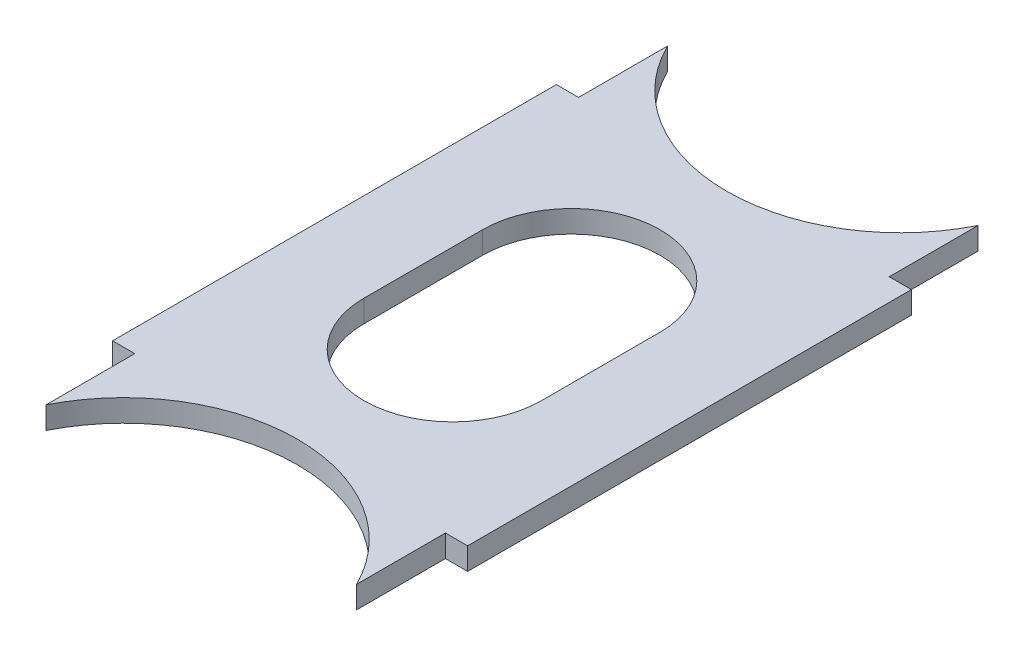
ISO-10303-21;
HEADER;
FILE_DESCRIPTION(('STEP AP214'),'2;1');
FILE_NAME('part.step','',(''),(''),'','','');
FILE_SCHEMA(('AUTOMOTIVE_DESIGN { 1 0 10303 214 1 1 1 1 }'));
ENDSEC;
DATA;
#1=APPLICATION_CONTEXT('core data for automotive mechanical design processes');
#2=APPLICATION_PROTOCOL_DEFINITION('international standard','automotive_design',2000,#1);
#3=PRODUCT_CONTEXT('',#1,'mechanical');
#4=PRODUCT('Part','Part','',(#3));
#5=PRODUCT_RELATED_PRODUCT_CATEGORY('part','',(#4));
#6=PRODUCT_DEFINITION_FORMATION('','',#4);
#7=PRODUCT_DEFINITION_CONTEXT('part definition',#1,'design');
#8=PRODUCT_DEFINITION('design','',#6,#7);
#9=PRODUCT_DEFINITION_SHAPE('','',#8);
#10=(LENGTH_UNIT() NAMED_UNIT(*) SI_UNIT(.MILLI.,.METRE.));
#11=(NAMED_UNIT(*) PLANE_ANGLE_UNIT() SI_UNIT($,.RADIAN.));
#12=(NAMED_UNIT(*) SI_UNIT($,.STERADIAN.) SOLID_ANGLE_UNIT());
#13=UNCERTAINTY_MEASURE_WITH_UNIT(LENGTH_MEASURE(1.E-05),#10,'distance_accuracy_value','');
#14=(GEOMETRIC_REPRESENTATION_CONTEXT(3) GLOBAL_UNCERTAINTY_ASSIGNED_CONTEXT((#13)) GLOBAL_UNIT_ASSIGNED_CONTEXT((#10,
#11,#12)) REPRESENTATION_CONTEXT('',''));
#15=CARTESIAN_POINT('',(0.,0.,0.));
#16=DIRECTION('',(0.,0.,1.));
#17=DIRECTION('',(1.,0.,0.));
#18=AXIS2_PLACEMENT_3D('',#15,#16,#17);
#19=CARTESIAN_POINT('',(0.,1.5875,-27.78125));
#20=DIRECTION('',(0.,-1.,0.));
#21=DIRECTION('',(0.,0.,-1.));
#22=AXIS2_PLACEMENT_3D('',#19,#20,#21);
#23=CYLINDRICAL_SURFACE('',#22,12.4241526999832);
#24=CARTESIAN_POINT('',(0.,0.,-27.78125));
#25=DIRECTION('',(0.,1.,0.));
#26=DIRECTION('',(0.,0.,1.));
#27=AXIS2_PLACEMENT_3D('',#24,#25,#26);
#28=CIRCLE('',#27,12.4241526999832);
#29=CARTESIAN_POINT('',(-11.1125,0.,-22.225));
#30=VERTEX_POINT('',#29);
#31=CARTESIAN_POINT('',(11.1125,0.,-22.225));
#32=VERTEX_POINT('',#31);
#33=EDGE_CURVE('E269',#30,#32,#28,.T.);
#34=ORIENTED_EDGE('',*,*,#33,.F.);
#35=DIRECTION('',(0.,-1.,0.));
#36=VECTOR('',#35,1.);
#37=CARTESIAN_POINT('',(-11.1125,1.5875,-22.225));
#38=LINE('',#37,#36);
#39=CARTESIAN_POINT('',(-11.1125,1.5875,-22.225));
#40=VERTEX_POINT('',#39);
#41=EDGE_CURVE('E11',#40,#30,#38,.T.);
#42=ORIENTED_EDGE('',*,*,#41,.F.);
#43=CARTESIAN_POINT('',(0.,1.5875,-27.78125));
#44=DIRECTION('',(0.,1.,0.));
#45=DIRECTION('',(0.,0.,1.));
#46=AXIS2_PLACEMENT_3D('',#43,#44,#45);
#47=CIRCLE('',#46,12.4241526999832);
#48=CARTESIAN_POINT('',(11.1125,1.5875,-22.225));
#49=VERTEX_POINT('',#48);
#50=EDGE_CURVE('E314',#40,#49,#47,.T.);
#51=ORIENTED_EDGE('',*,*,#50,.T.);
#52=DIRECTION('',(0.,-1.,0.));
#53=VECTOR('',#52,1.);
#54=CARTESIAN_POINT('',(11.1125,1.5875,-22.225));
#55=LINE('',#54,#53);
#56=EDGE_CURVE('E59',#49,#32,#55,.T.);
#57=ORIENTED_EDGE('',*,*,#56,.T.);
#58=EDGE_LOOP('',(#34,#42,#51,#57));
#59=FACE_BOUND('',#58,.T.);
#60=ADVANCED_FACE('F39',(#59),#23,.F.);
#61=CARTESIAN_POINT('',(-11.1125,1.5875,0.));
#62=DIRECTION('',(1.,0.,0.));
#63=DIRECTION('',(0.,0.,-1.));
#64=AXIS2_PLACEMENT_3D('',#61,#62,#63);
#65=PLANE('',#64);
#66=DIRECTION('',(0.,0.,1.));
#67=VECTOR('',#66,1.);
#68=CARTESIAN_POINT('',(-11.1125,0.,0.));
#69=LINE('',#68,#67);
#70=CARTESIAN_POINT('',(-11.1125,0.,-15.875));
#71=VERTEX_POINT('',#70);
#72=EDGE_CURVE('E265',#30,#71,#69,.T.);
#73=ORIENTED_EDGE('',*,*,#72,.T.);
#74=DIRECTION('',(0.,-1.,0.));
#75=VECTOR('',#74,1.);
#76=CARTESIAN_POINT('',(-11.1125,1.5875,-15.875));
#77=LINE('',#76,#75);
#78=CARTESIAN_POINT('',(-11.1125,1.5875,-15.875));
#79=VERTEX_POINT('',#78);
#80=EDGE_CURVE('E50',#79,#71,#77,.T.);
#81=ORIENTED_EDGE('',*,*,#80,.F.);
#82=DIRECTION('',(0.,0.,1.));
#83=VECTOR('',#82,1.);
#84=CARTESIAN_POINT('',(-11.1125,1.5875,0.));
#85=LINE('',#84,#83);
#86=EDGE_CURVE('E311',#40,#79,#85,.T.);
#87=ORIENTED_EDGE('',*,*,#86,.F.);
#88=ORIENTED_EDGE('',*,*,#41,.T.);
#89=EDGE_LOOP('',(#73,#81,#87,#88));
#90=FACE_BOUND('',#89,.T.);
#91=ADVANCED_FACE('F356',(#90),#65,.F.);
#92=CARTESIAN_POINT('',(0.,1.5875,-15.875));
#93=DIRECTION('',(0.,0.,-1.));
#94=DIRECTION('',(-1.,0.,0.));
#95=AXIS2_PLACEMENT_3D('',#92,#93,#94);
#96=PLANE('',#95);
#97=DIRECTION('',(1.,0.,0.));
#98=VECTOR('',#97,1.);
#99=CARTESIAN_POINT('',(0.,0.,-15.875));
#100=LINE('',#99,#98);
#101=CARTESIAN_POINT('',(-12.7,0.,-15.875));
#102=VERTEX_POINT('',#101);
#103=EDGE_CURVE('E261',#102,#71,#100,.T.);
#104=ORIENTED_EDGE('',*,*,#103,.F.);
#105=DIRECTION('',(0.,-1.,0.));
#106=VECTOR('',#105,1.);
#107=CARTESIAN_POINT('',(-12.7,1.5875,-15.875));
#108=LINE('',#107,#106);
#109=CARTESIAN_POINT('',(-12.7,1.5875,-15.875));
#110=VERTEX_POINT('',#109);
#111=EDGE_CURVE('E210',#110,#102,#108,.T.);
#112=ORIENTED_EDGE('',*,*,#111,.F.);
#113=DIRECTION('',(1.,0.,0.));
#114=VECTOR('',#113,1.);
#115=CARTESIAN_POINT('',(0.,1.5875,-15.875));
#116=LINE('',#115,#114);
#117=EDGE_CURVE('E307',#110,#79,#116,.T.);
#118=ORIENTED_EDGE('',*,*,#117,.T.);
#119=ORIENTED_EDGE('',*,*,#80,.T.);
#120=EDGE_LOOP('',(#104,#112,#118,#119));
#121=FACE_BOUND('',#120,.T.);
#122=ADVANCED_FACE('F361',(#121),#96,.T.);
#123=CARTESIAN_POINT('',(-12.7,1.5875,0.));
#124=DIRECTION('',(-1.,0.,0.));
#125=DIRECTION('',(0.,0.,1.));
#126=AXIS2_PLACEMENT_3D('',#123,#124,#125);
#127=PLANE('',#126);
#128=DIRECTION('',(0.,0.,-1.));
#129=VECTOR('',#128,1.);
#130=CARTESIAN_POINT('',(-12.7,0.,0.));
#131=LINE('',#130,#129);
#132=CARTESIAN_POINT('',(-12.7,0.,15.875));
#133=VERTEX_POINT('',#132);
#134=EDGE_CURVE('E257',#133,#102,#131,.T.);
#135=ORIENTED_EDGE('',*,*,#134,.F.);
#136=DIRECTION('',(0.,-1.,0.));
#137=VECTOR('',#136,1.);
#138=CARTESIAN_POINT('',(-12.7,1.5875,15.875));
#139=LINE('',#138,#137);
#140=CARTESIAN_POINT('',(-12.7,1.5875,15.875));
#141=VERTEX_POINT('',#140);
#142=EDGE_CURVE('E207',#141,#133,#139,.T.);
#143=ORIENTED_EDGE('',*,*,#142,.F.);
#144=DIRECTION('',(0.,0.,-1.));
#145=VECTOR('',#144,1.);
#146=CARTESIAN_POINT('',(-12.7,1.5875,0.));
#147=LINE('',#146,#145);
#148=EDGE_CURVE('E303',#141,#110,#147,.T.);
#149=ORIENTED_EDGE('',*,*,#148,.T.);
#150=ORIENTED_EDGE('',*,*,#111,.T.);
#151=EDGE_LOOP('',(#135,#143,#149,#150));
#152=FACE_BOUND('',#151,.T.);
#153=ADVANCED_FACE('F470',(#152),#127,.T.);
#154=CARTESIAN_POINT('',(0.,1.5875,15.875));
#155=DIRECTION('',(0.,0.,1.));
#156=DIRECTION('',(1.,0.,0.));
#157=AXIS2_PLACEMENT_3D('',#154,#155,#156);
#158=PLANE('',#157);
#159=DIRECTION('',(-1.,0.,0.));
#160=VECTOR('',#159,1.);
#161=CARTESIAN_POINT('',(0.,0.,15.875));
#162=LINE('',#161,#160);
#163=CARTESIAN_POINT('',(-11.1125,0.,15.875));
#164=VERTEX_POINT('',#163);
#165=EDGE_CURVE('E253',#164,#133,#162,.T.);
#166=ORIENTED_EDGE('',*,*,#165,.F.);
#167=DIRECTION('',(0.,-1.,0.));
#168=VECTOR('',#167,1.);
#169=CARTESIAN_POINT('',(-11.1125,1.5875,15.875));
#170=LINE('',#169,#168);
#171=CARTESIAN_POINT('',(-11.1125,1.5875,15.875));
#172=VERTEX_POINT('',#171);
#173=EDGE_CURVE('E204',#172,#164,#170,.T.);
#174=ORIENTED_EDGE('',*,*,#173,.F.);
#175=DIRECTION('',(-1.,0.,0.));
#176=VECTOR('',#175,1.);
#177=CARTESIAN_POINT('',(0.,1.5875,15.875));
#178=LINE('',#177,#176);
#179=EDGE_CURVE('E299',#172,#141,#178,.T.);
#180=ORIENTED_EDGE('',*,*,#179,.T.);
#181=ORIENTED_EDGE('',*,*,#142,.T.);
#182=EDGE_LOOP('',(#166,#174,#180,#181));
#183=FACE_BOUND('',#182,.T.);
#184=ADVANCED_FACE('F461',(#183),#158,.T.);
#185=CARTESIAN_POINT('',(-11.1125,0.,22.225));
#186=VERTEX_POINT('',#185);
#187=EDGE_CURVE('E252',#164,#186,#69,.T.);
#188=ORIENTED_EDGE('',*,*,#187,.T.);
#189=DIRECTION('',(0.,-1.,0.));
#190=VECTOR('',#189,1.);
#191=CARTESIAN_POINT('',(-11.1125,1.5875,22.225));
#192=LINE('',#191,#190);
#193=CARTESIAN_POINT('',(-11.1125,1.5875,22.225));
#194=VERTEX_POINT('',#193);
#195=EDGE_CURVE('E201',#194,#186,#192,.T.);
#196=ORIENTED_EDGE('',*,*,#195,.F.);
#197=EDGE_CURVE('E298',#172,#194,#85,.T.);
#198=ORIENTED_EDGE('',*,*,#197,.F.);
#199=ORIENTED_EDGE('',*,*,#173,.T.);
#200=EDGE_LOOP('',(#188,#196,#198,#199));
#201=FACE_BOUND('',#200,.T.);
#202=ADVANCED_FACE('F364',(#201),#65,.F.);
#203=CARTESIAN_POINT('',(0.,1.5875,27.78125));
#204=DIRECTION('',(0.,-1.,0.));
#205=DIRECTION('',(0.,0.,-1.));
#206=AXIS2_PLACEMENT_3D('',#203,#204,#205);
#207=CYLINDRICAL_SURFACE('',#206,12.4241526999832);
#208=CARTESIAN_POINT('',(0.,0.,27.78125));
#209=DIRECTION('',(0.,1.,0.));
#210=DIRECTION('',(0.,0.,1.));
#211=AXIS2_PLACEMENT_3D('',#208,#209,#210);
#212=CIRCLE('',#211,12.4241526999832);
#213=CARTESIAN_POINT('',(11.1125,0.,22.225));
#214=VERTEX_POINT('',#213);
#215=EDGE_CURVE('E248',#214,#186,#212,.T.);
#216=ORIENTED_EDGE('',*,*,#215,.F.);
#217=DIRECTION('',(0.,-1.,0.));
#218=VECTOR('',#217,1.);
#219=CARTESIAN_POINT('',(11.1125,1.5875,22.225));
#220=LINE('',#219,#218);
#221=CARTESIAN_POINT('',(11.1125,1.5875,22.225));
#222=VERTEX_POINT('',#221);
#223=EDGE_CURVE('E198',#222,#214,#220,.T.);
#224=ORIENTED_EDGE('',*,*,#223,.F.);
#225=CARTESIAN_POINT('',(0.,1.5875,27.78125));
#226=DIRECTION('',(0.,1.,0.));
#227=DIRECTION('',(0.,0.,1.));
#228=AXIS2_PLACEMENT_3D('',#225,#226,#227);
#229=CIRCLE('',#228,12.4241526999832);
#230=EDGE_CURVE('E294',#222,#194,#229,.T.);
#231=ORIENTED_EDGE('',*,*,#230,.T.);
#232=ORIENTED_EDGE('',*,*,#195,.T.);
#233=EDGE_LOOP('',(#216,#224,#231,#232));
#234=FACE_BOUND('',#233,.T.);
#235=ADVANCED_FACE('F353',(#234),#207,.F.);
#236=CARTESIAN_POINT('',(11.1125,1.5875,0.));
#237=DIRECTION('',(1.,0.,0.));
#238=DIRECTION('',(0.,0.,-1.));
#239=AXIS2_PLACEMENT_3D('',#236,#237,#238);
#240=PLANE('',#239);
#241=DIRECTION('',(0.,0.,1.));
#242=VECTOR('',#241,1.);
#243=CARTESIAN_POINT('',(11.1125,0.,0.));
#244=LINE('',#243,#242);
#245=CARTESIAN_POINT('',(11.1125,0.,15.875));
#246=VERTEX_POINT('',#245);
#247=EDGE_CURVE('E244',#246,#214,#244,.T.);
#248=ORIENTED_EDGE('',*,*,#247,.F.);
#249=DIRECTION('',(0.,-1.,0.));
#250=VECTOR('',#249,1.);
#251=CARTESIAN_POINT('',(11.1125,1.5875,15.875));
#252=LINE('',#251,#250);
#253=CARTESIAN_POINT('',(11.1125,1.5875,15.875));
#254=VERTEX_POINT('',#253);
#255=EDGE_CURVE('E191',#254,#246,#252,.T.);
#256=ORIENTED_EDGE('',*,*,#255,.F.);
#257=DIRECTION('',(0.,0.,1.));
#258=VECTOR('',#257,1.);
#259=CARTESIAN_POINT('',(11.1125,1.5875,0.));
#260=LINE('',#259,#258);
#261=EDGE_CURVE('E290',#254,#222,#260,.T.);
#262=ORIENTED_EDGE('',*,*,#261,.T.);
#263=ORIENTED_EDGE('',*,*,#223,.T.);
#264=EDGE_LOOP('',(#248,#256,#262,#263));
#265=FACE_BOUND('',#264,.T.);
#266=ADVANCED_FACE('F339',(#265),#240,.T.);
#267=CARTESIAN_POINT('',(0.,1.5875,15.875));
#268=DIRECTION('',(0.,0.,-1.));
#269=DIRECTION('',(-1.,0.,0.));
#270=AXIS2_PLACEMENT_3D('',#267,#268,#269);
#271=PLANE('',#270);
#272=DIRECTION('',(1.,0.,0.));
#273=VECTOR('',#272,1.);
#274=CARTESIAN_POINT('',(0.,0.,15.875));
#275=LINE('',#274,#273);
#276=CARTESIAN_POINT('',(12.7,0.,15.875));
#277=VERTEX_POINT('',#276);
#278=EDGE_CURVE('E240',#246,#277,#275,.T.);
#279=ORIENTED_EDGE('',*,*,#278,.T.);
#280=DIRECTION('',(0.,-1.,0.));
#281=VECTOR('',#280,1.);
#282=CARTESIAN_POINT('',(12.7,1.5875,15.875));
#283=LINE('',#282,#281);
#284=CARTESIAN_POINT('',(12.7,1.5875,15.875));
#285=VERTEX_POINT('',#284);
#286=EDGE_CURVE('E186',#285,#277,#283,.T.);
#287=ORIENTED_EDGE('',*,*,#286,.F.);
#288=DIRECTION('',(1.,0.,0.));
#289=VECTOR('',#288,1.);
#290=CARTESIAN_POINT('',(0.,1.5875,15.875));
#291=LINE('',#290,#289);
#292=EDGE_CURVE('E177',#254,#285,#291,.T.);
#293=ORIENTED_EDGE('',*,*,#292,.F.);
#294=ORIENTED_EDGE('',*,*,#255,.T.);
#295=EDGE_LOOP('',(#279,#287,#293,#294));
#296=FACE_BOUND('',#295,.T.);
#297=ADVANCED_FACE('F352',(#296),#271,.F.);
#298=CARTESIAN_POINT('',(12.7,1.5875,0.));
#299=DIRECTION('',(-1.,0.,0.));
#300=DIRECTION('',(0.,0.,1.));
#301=AXIS2_PLACEMENT_3D('',#298,#299,#300);
#302=PLANE('',#301);
#303=DIRECTION('',(0.,0.,-1.));
#304=VECTOR('',#303,1.);
#305=CARTESIAN_POINT('',(12.7,0.,0.));
#306=LINE('',#305,#304);
#307=CARTESIAN_POINT('',(12.7,0.,-15.875));
#308=VERTEX_POINT('',#307);
#309=EDGE_CURVE('E184',#277,#308,#306,.T.);
#310=ORIENTED_EDGE('',*,*,#309,.T.);
#311=DIRECTION('',(0.,-1.,0.));
#312=VECTOR('',#311,1.);
#313=CARTESIAN_POINT('',(12.7,1.5875,-15.875));
#314=LINE('',#313,#312);
#315=CARTESIAN_POINT('',(12.7,1.5875,-15.875));
#316=VERTEX_POINT('',#315);
#317=EDGE_CURVE('E164',#316,#308,#314,.T.);
#318=ORIENTED_EDGE('',*,*,#317,.F.);
#319=DIRECTION('',(0.,0.,-1.));
#320=VECTOR('',#319,1.);
#321=CARTESIAN_POINT('',(12.7,1.5875,0.));
#322=LINE('',#321,#320);
#323=EDGE_CURVE('E170',#285,#316,#322,.T.);
#324=ORIENTED_EDGE('',*,*,#323,.F.);
#325=ORIENTED_EDGE('',*,*,#286,.T.);
#326=EDGE_LOOP('',(#310,#318,#324,#325));
#327=FACE_BOUND('',#326,.T.);
#328=ADVANCED_FACE('F183',(#327),#302,.F.);
#329=CARTESIAN_POINT('',(0.,1.5875,-15.875));
#330=DIRECTION('',(0.,0.,1.));
#331=DIRECTION('',(1.,0.,0.));
#332=AXIS2_PLACEMENT_3D('',#329,#330,#331);
#333=PLANE('',#332);
#334=DIRECTION('',(-1.,0.,0.));
#335=VECTOR('',#334,1.);
#336=CARTESIAN_POINT('',(0.,0.,-15.875));
#337=LINE('',#336,#335);
#338=CARTESIAN_POINT('',(11.1125,0.,-15.875));
#339=VERTEX_POINT('',#338);
#340=EDGE_CURVE('E234',#308,#339,#337,.T.);
#341=ORIENTED_EDGE('',*,*,#340,.T.);
#342=DIRECTION('',(0.,-1.,0.));
#343=VECTOR('',#342,1.);
#344=CARTESIAN_POINT('',(11.1125,1.5875,-15.875));
#345=LINE('',#344,#343);
#346=CARTESIAN_POINT('',(11.1125,1.5875,-15.875));
#347=VERTEX_POINT('',#346);
#348=EDGE_CURVE('E109',#347,#339,#345,.T.);
#349=ORIENTED_EDGE('',*,*,#348,.F.);
#350=DIRECTION('',(-1.,0.,0.));
#351=VECTOR('',#350,1.);
#352=CARTESIAN_POINT('',(0.,1.5875,-15.875));
#353=LINE('',#352,#351);
#354=EDGE_CURVE('E160',#316,#347,#353,.T.);
#355=ORIENTED_EDGE('',*,*,#354,.F.);
#356=ORIENTED_EDGE('',*,*,#317,.T.);
#357=EDGE_LOOP('',(#341,#349,#355,#356));
#358=FACE_BOUND('',#357,.T.);
#359=ADVANCED_FACE('F162',(#358),#333,.F.);
#360=CARTESIAN_POINT('',(0.,1.5875,4.2445973000168));
#361=DIRECTION('',(0.,-1.,0.));
#362=DIRECTION('',(0.,0.,-1.));
#363=AXIS2_PLACEMENT_3D('',#360,#361,#362);
#364=CYLINDRICAL_SURFACE('',#363,6.35);
#365=CARTESIAN_POINT('',(0.,0.,4.2445973000168));
#366=DIRECTION('',(0.,1.,0.));
#367=DIRECTION('',(0.,0.,1.));
#368=AXIS2_PLACEMENT_3D('',#365,#366,#367);
#369=CIRCLE('',#368,6.35);
#370=CARTESIAN_POINT('',(-6.35,0.,4.2445973000168));
#371=VERTEX_POINT('',#370);
#372=CARTESIAN_POINT('',(6.35,0.,4.2445973000168));
#373=VERTEX_POINT('',#372);
#374=EDGE_CURVE('E284',#371,#373,#369,.T.);
#375=ORIENTED_EDGE('',*,*,#374,.F.);
#376=DIRECTION('',(0.,-1.,0.));
#377=VECTOR('',#376,1.);
#378=CARTESIAN_POINT('',(-6.35,1.5875,4.2445973000168));
#379=LINE('',#378,#377);
#380=CARTESIAN_POINT('',(-6.35,1.5875,4.2445973000168));
#381=VERTEX_POINT('',#380);
#382=EDGE_CURVE('E43',#381,#371,#379,.T.);
#383=ORIENTED_EDGE('',*,*,#382,.F.);
#384=CARTESIAN_POINT('',(0.,1.5875,4.2445973000168));
#385=DIRECTION('',(0.,1.,0.));
#386=DIRECTION('',(0.,0.,1.));
#387=AXIS2_PLACEMENT_3D('',#384,#385,#386);
#388=CIRCLE('',#387,6.35);
#389=CARTESIAN_POINT('',(6.35,1.5875,4.2445973000168));
#390=VERTEX_POINT('',#389);
#391=EDGE_CURVE('E326',#381,#390,#388,.T.);
#392=ORIENTED_EDGE('',*,*,#391,.T.);
#393=DIRECTION('',(0.,-1.,0.));
#394=VECTOR('',#393,1.);
#395=CARTESIAN_POINT('',(6.35,1.5875,4.2445973000168));
#396=LINE('',#395,#394);
#397=EDGE_CURVE('E215',#390,#373,#396,.T.);
#398=ORIENTED_EDGE('',*,*,#397,.T.);
#399=EDGE_LOOP('',(#375,#383,#392,#398));
#400=FACE_BOUND('',#399,.T.);
#401=ADVANCED_FACE('F41',(#400),#364,.F.);
#402=CARTESIAN_POINT('',(-6.35,1.5875,0.));
#403=DIRECTION('',(1.,0.,0.));
#404=DIRECTION('',(0.,0.,-1.));
#405=AXIS2_PLACEMENT_3D('',#402,#403,#404);
#406=PLANE('',#405);
#407=DIRECTION('',(0.,0.,1.));
#408=VECTOR('',#407,1.);
#409=CARTESIAN_POINT('',(-6.35,0.,0.));
#410=LINE('',#409,#408);
#411=CARTESIAN_POINT('',(-6.35,0.,-4.2445973000168));
#412=VERTEX_POINT('',#411);
#413=EDGE_CURVE('E280',#412,#371,#410,.T.);
#414=ORIENTED_EDGE('',*,*,#413,.F.);
#415=DIRECTION('',(0.,-1.,0.));
#416=VECTOR('',#415,1.);
#417=CARTESIAN_POINT('',(-6.35,1.5875,-4.2445973000168));
#418=LINE('',#417,#416);
#419=CARTESIAN_POINT('',(-6.35,1.5875,-4.2445973000168));
#420=VERTEX_POINT('',#419);
#421=EDGE_CURVE('E220',#420,#412,#418,.T.);
#422=ORIENTED_EDGE('',*,*,#421,.F.);
#423=DIRECTION('',(0.,0.,1.));
#424=VECTOR('',#423,1.);
#425=CARTESIAN_POINT('',(-6.35,1.5875,0.));
#426=LINE('',#425,#424);
#427=EDGE_CURVE('E323',#420,#381,#426,.T.);
#428=ORIENTED_EDGE('',*,*,#427,.T.);
#429=ORIENTED_EDGE('',*,*,#382,.T.);
#430=EDGE_LOOP('',(#414,#422,#428,#429));
#431=FACE_BOUND('',#430,.T.);
#432=ADVANCED_FACE('F369',(#431),#406,.T.);
#433=CARTESIAN_POINT('',(0.,1.5875,-4.2445973000168));
#434=DIRECTION('',(0.,-1.,0.));
#435=DIRECTION('',(0.,0.,-1.));
#436=AXIS2_PLACEMENT_3D('',#433,#434,#435);
#437=CYLINDRICAL_SURFACE('',#436,6.35);
#438=CARTESIAN_POINT('',(0.,0.,-4.2445973000168));
#439=DIRECTION('',(0.,1.,0.));
#440=DIRECTION('',(0.,0.,1.));
#441=AXIS2_PLACEMENT_3D('',#438,#439,#440);
#442=CIRCLE('',#441,6.35);
#443=CARTESIAN_POINT('',(6.35,0.,-4.2445973000168));
#444=VERTEX_POINT('',#443);
#445=EDGE_CURVE('E276',#444,#412,#442,.T.);
#446=ORIENTED_EDGE('',*,*,#445,.F.);
#447=DIRECTION('',(0.,-1.,0.));
#448=VECTOR('',#447,1.);
#449=CARTESIAN_POINT('',(6.35,1.5875,-4.2445973000168));
#450=LINE('',#449,#448);
#451=CARTESIAN_POINT('',(6.35,1.5875,-4.2445973000168));
#452=VERTEX_POINT('',#451);
#453=EDGE_CURVE('E218',#452,#444,#450,.T.);
#454=ORIENTED_EDGE('',*,*,#453,.F.);
#455=CARTESIAN_POINT('',(0.,1.5875,-4.2445973000168));
#456=DIRECTION('',(0.,1.,0.));
#457=DIRECTION('',(0.,0.,1.));
#458=AXIS2_PLACEMENT_3D('',#455,#456,#457);
#459=CIRCLE('',#458,6.35);
#460=EDGE_CURVE('E320',#452,#420,#459,.T.);
#461=ORIENTED_EDGE('',*,*,#460,.T.);
#462=ORIENTED_EDGE('',*,*,#421,.T.);
#463=EDGE_LOOP('',(#446,#454,#461,#462));
#464=FACE_BOUND('',#463,.T.);
#465=ADVANCED_FACE('F346',(#464),#437,.F.);
#466=CARTESIAN_POINT('',(6.35,1.5875,0.));
#467=DIRECTION('',(1.,0.,0.));
#468=DIRECTION('',(0.,0.,-1.));
#469=AXIS2_PLACEMENT_3D('',#466,#467,#468);
#470=PLANE('',#469);
#471=DIRECTION('',(0.,0.,1.));
#472=VECTOR('',#471,1.);
#473=CARTESIAN_POINT('',(6.35,0.,0.));
#474=LINE('',#473,#472);
#475=EDGE_CURVE('E272',#444,#373,#474,.T.);
#476=ORIENTED_EDGE('',*,*,#475,.T.);
#477=ORIENTED_EDGE('',*,*,#397,.F.);
#478=DIRECTION('',(0.,0.,1.));
#479=VECTOR('',#478,1.);
#480=CARTESIAN_POINT('',(6.35,1.5875,0.));
#481=LINE('',#480,#479);
#482=EDGE_CURVE('E317',#452,#390,#481,.T.);
#483=ORIENTED_EDGE('',*,*,#482,.F.);
#484=ORIENTED_EDGE('',*,*,#453,.T.);
#485=EDGE_LOOP('',(#476,#477,#483,#484));
#486=FACE_BOUND('',#485,.T.);
#487=ADVANCED_FACE('F337',(#486),#470,.F.);
#488=EDGE_CURVE('E237',#32,#339,#244,.T.);
#489=ORIENTED_EDGE('',*,*,#488,.F.);
#490=ORIENTED_EDGE('',*,*,#56,.F.);
#491=EDGE_CURVE('E169',#49,#347,#260,.T.);
#492=ORIENTED_EDGE('',*,*,#491,.T.);
#493=ORIENTED_EDGE('',*,*,#348,.T.);
#494=EDGE_LOOP('',(#489,#490,#492,#493));
#495=FACE_BOUND('',#494,.T.);
#496=ADVANCED_FACE('F335',(#495),#240,.T.);
#497=CARTESIAN_POINT('',(0.,1.5875,0.));
#498=DIRECTION('',(0.,1.,0.));
#499=DIRECTION('',(0.,0.,1.));
#500=AXIS2_PLACEMENT_3D('',#497,#498,#499);
#501=PLANE('',#500);
#502=ORIENTED_EDGE('',*,*,#391,.F.);
#503=ORIENTED_EDGE('',*,*,#427,.F.);
#504=ORIENTED_EDGE('',*,*,#460,.F.);
#505=ORIENTED_EDGE('',*,*,#482,.T.);
#506=EDGE_LOOP('',(#502,#503,#504,#505));
#507=FACE_BOUND('',#506,.T.);
#508=ORIENTED_EDGE('',*,*,#50,.F.);
#509=ORIENTED_EDGE('',*,*,#86,.T.);
#510=ORIENTED_EDGE('',*,*,#117,.F.);
#511=ORIENTED_EDGE('',*,*,#148,.F.);
#512=ORIENTED_EDGE('',*,*,#179,.F.);
#513=ORIENTED_EDGE('',*,*,#197,.T.);
#514=ORIENTED_EDGE('',*,*,#230,.F.);
#515=ORIENTED_EDGE('',*,*,#261,.F.);
#516=ORIENTED_EDGE('',*,*,#292,.T.);
#517=ORIENTED_EDGE('',*,*,#323,.T.);
#518=ORIENTED_EDGE('',*,*,#354,.T.);
#519=ORIENTED_EDGE('',*,*,#491,.F.);
#520=EDGE_LOOP('',(#508,#509,#510,#511,#512,#513,#514,#515,#516,#517,#518,#519));
#521=FACE_BOUND('',#520,.T.);
#522=ADVANCED_FACE('F174',(#507,#521),#501,.T.);
#523=CARTESIAN_POINT('',(0.,0.,0.));
#524=DIRECTION('',(0.,1.,0.));
#525=DIRECTION('',(0.,0.,1.));
#526=AXIS2_PLACEMENT_3D('',#523,#524,#525);
#527=PLANE('',#526);
#528=ORIENTED_EDGE('',*,*,#374,.T.);
#529=ORIENTED_EDGE('',*,*,#475,.F.);
#530=ORIENTED_EDGE('',*,*,#445,.T.);
#531=ORIENTED_EDGE('',*,*,#413,.T.);
#532=EDGE_LOOP('',(#528,#529,#530,#531));
#533=FACE_BOUND('',#532,.T.);
#534=ORIENTED_EDGE('',*,*,#33,.T.);
#535=ORIENTED_EDGE('',*,*,#488,.T.);
#536=ORIENTED_EDGE('',*,*,#340,.F.);
#537=ORIENTED_EDGE('',*,*,#309,.F.);
#538=ORIENTED_EDGE('',*,*,#278,.F.);
#539=ORIENTED_EDGE('',*,*,#247,.T.);
#540=ORIENTED_EDGE('',*,*,#215,.T.);
#541=ORIENTED_EDGE('',*,*,#187,.F.);
#542=ORIENTED_EDGE('',*,*,#165,.T.);
#543=ORIENTED_EDGE('',*,*,#134,.T.);
#544=ORIENTED_EDGE('',*,*,#103,.T.);
#545=ORIENTED_EDGE('',*,*,#72,.F.);
#546=EDGE_LOOP('',(#534,#535,#536,#537,#538,#539,#540,#541,#542,#543,#544,#545));
#547=FACE_BOUND('',#546,.T.);
#548=ADVANCED_FACE('F333',(#533,#547),#527,.F.);
#549=CLOSED_SHELL('',(#60,#91,#122,#153,#184,#202,#235,#266,#297,#328,#359,#401,#432,#465,#487,
#496,#522,#548));
#550=MANIFOLD_SOLID_BREP('B2',#549);
#551=ADVANCED_BREP_SHAPE_REPRESENTATION('',(#18,#550),#14);
#552=SHAPE_DEFINITION_REPRESENTATION(#9,#551);
ENDSEC;
END-ISO-10303-21;
